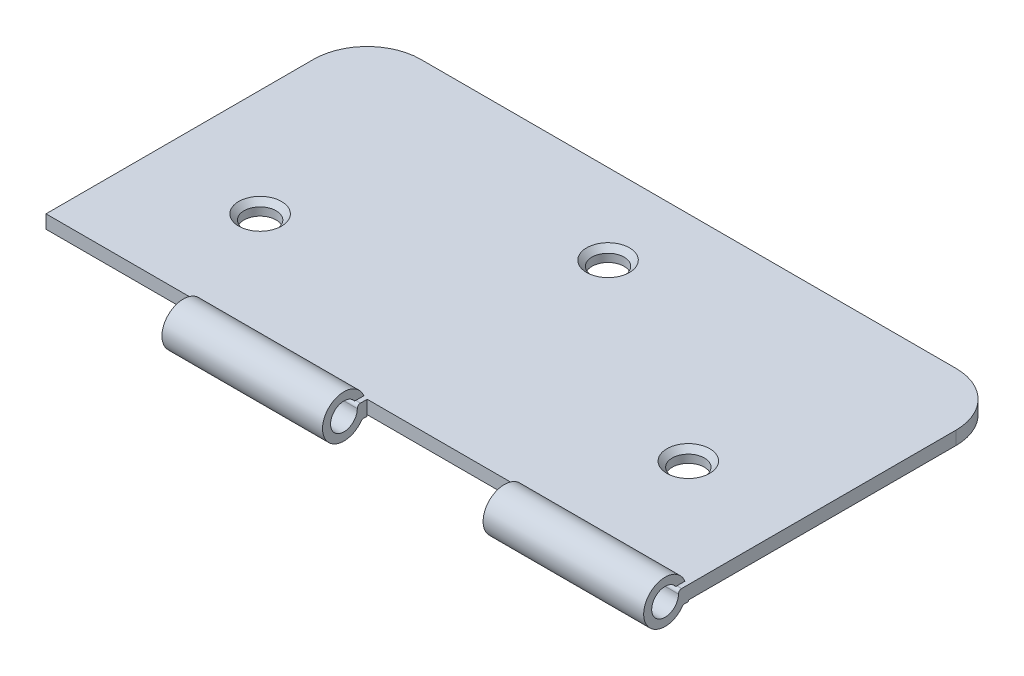
ISO-10303-21;
HEADER;
FILE_DESCRIPTION(('STEP AP214'),'2;1');
FILE_NAME('part.step','',(''),(''),'','','');
FILE_SCHEMA(('AUTOMOTIVE_DESIGN { 1 0 10303 214 1 1 1 1 }'));
ENDSEC;
DATA;
#1=APPLICATION_CONTEXT('core data for automotive mechanical design processes');
#2=APPLICATION_PROTOCOL_DEFINITION('international standard','automotive_design',2000,#1);
#3=PRODUCT_CONTEXT('',#1,'mechanical');
#4=PRODUCT('Part','Part','',(#3));
#5=PRODUCT_RELATED_PRODUCT_CATEGORY('part','',(#4));
#6=PRODUCT_DEFINITION_FORMATION('','',#4);
#7=PRODUCT_DEFINITION_CONTEXT('part definition',#1,'design');
#8=PRODUCT_DEFINITION('design','',#6,#7);
#9=PRODUCT_DEFINITION_SHAPE('','',#8);
#10=(LENGTH_UNIT() NAMED_UNIT(*) SI_UNIT(.MILLI.,.METRE.));
#11=(NAMED_UNIT(*) PLANE_ANGLE_UNIT() SI_UNIT($,.RADIAN.));
#12=(NAMED_UNIT(*) SI_UNIT($,.STERADIAN.) SOLID_ANGLE_UNIT());
#13=UNCERTAINTY_MEASURE_WITH_UNIT(LENGTH_MEASURE(1.E-05),#10,'distance_accuracy_value','');
#14=(GEOMETRIC_REPRESENTATION_CONTEXT(3) GLOBAL_UNCERTAINTY_ASSIGNED_CONTEXT((#13)) GLOBAL_UNIT_ASSIGNED_CONTEXT((#10,
#11,#12)) REPRESENTATION_CONTEXT('',''));
#15=CARTESIAN_POINT('',(0.,0.,0.));
#16=DIRECTION('',(0.,0.,1.));
#17=DIRECTION('',(1.,0.,0.));
#18=AXIS2_PLACEMENT_3D('',#15,#16,#17);
#19=CARTESIAN_POINT('',(-30.,2.5,30.));
#20=DIRECTION('',(0.,1.,0.));
#21=DIRECTION('',(0.,0.,1.));
#22=AXIS2_PLACEMENT_3D('',#19,#20,#21);
#23=PLANE('',#22);
#24=DIRECTION('',(0.,0.,1.));
#25=VECTOR('',#24,1.);
#26=CARTESIAN_POINT('',(0.,2.5,30.));
#27=LINE('',#26,#25);
#28=CARTESIAN_POINT('',(0.,2.5,30.));
#29=VERTEX_POINT('',#28);
#30=CARTESIAN_POINT('',(0.,2.5,31.25));
#31=VERTEX_POINT('',#30);
#32=EDGE_CURVE('E142',#29,#31,#27,.T.);
#33=ORIENTED_EDGE('',*,*,#32,.F.);
#34=DIRECTION('',(1.,0.,0.));
#35=VECTOR('',#34,1.);
#36=CARTESIAN_POINT('',(60.,2.5,30.));
#37=LINE('',#36,#35);
#38=CARTESIAN_POINT('',(30.,2.5,30.));
#39=VERTEX_POINT('',#38);
#40=EDGE_CURVE('E86',#29,#39,#37,.T.);
#41=ORIENTED_EDGE('',*,*,#40,.T.);
#42=DIRECTION('',(0.,0.,1.));
#43=VECTOR('',#42,1.);
#44=CARTESIAN_POINT('',(30.,2.5,30.));
#45=LINE('',#44,#43);
#46=CARTESIAN_POINT('',(30.,2.5,31.25));
#47=VERTEX_POINT('',#46);
#48=EDGE_CURVE('E311',#39,#47,#45,.T.);
#49=ORIENTED_EDGE('',*,*,#48,.T.);
#50=DIRECTION('',(1.,0.,0.));
#51=VECTOR('',#50,1.);
#52=CARTESIAN_POINT('',(30.,2.5,31.25));
#53=LINE('',#52,#51);
#54=CARTESIAN_POINT('',(60.,2.5,31.25));
#55=VERTEX_POINT('',#54);
#56=EDGE_CURVE('E240',#47,#55,#53,.T.);
#57=ORIENTED_EDGE('',*,*,#56,.T.);
#58=DIRECTION('',(0.,0.,1.));
#59=VECTOR('',#58,1.);
#60=CARTESIAN_POINT('',(60.,2.5,30.));
#61=LINE('',#60,#59);
#62=CARTESIAN_POINT('',(60.,2.5,-20.));
#63=VERTEX_POINT('',#62);
#64=EDGE_CURVE('E310',#63,#55,#61,.T.);
#65=ORIENTED_EDGE('',*,*,#64,.F.);
#66=CARTESIAN_POINT('',(50.,2.5,-20.));
#67=DIRECTION('',(0.,-1.,0.));
#68=DIRECTION('',(0.,0.,-1.));
#69=AXIS2_PLACEMENT_3D('',#66,#67,#68);
#70=CIRCLE('',#69,10.);
#71=CARTESIAN_POINT('',(50.,2.5,-30.));
#72=VERTEX_POINT('',#71);
#73=EDGE_CURVE('E441',#63,#72,#70,.F.);
#74=ORIENTED_EDGE('',*,*,#73,.T.);
#75=DIRECTION('',(-1.,0.,0.));
#76=VECTOR('',#75,1.);
#77=CARTESIAN_POINT('',(60.,2.5,-30.));
#78=LINE('',#77,#76);
#79=CARTESIAN_POINT('',(-50.,2.5,-30.));
#80=VERTEX_POINT('',#79);
#81=EDGE_CURVE('E267',#72,#80,#78,.T.);
#82=ORIENTED_EDGE('',*,*,#81,.T.);
#83=CARTESIAN_POINT('',(-50.,2.5,-20.));
#84=DIRECTION('',(0.,-1.,0.));
#85=DIRECTION('',(0.,0.,-1.));
#86=AXIS2_PLACEMENT_3D('',#83,#84,#85);
#87=CIRCLE('',#86,10.);
#88=CARTESIAN_POINT('',(-60.,2.5,-20.));
#89=VERTEX_POINT('',#88);
#90=EDGE_CURVE('E442',#80,#89,#87,.F.);
#91=ORIENTED_EDGE('',*,*,#90,.T.);
#92=DIRECTION('',(0.,0.,1.));
#93=VECTOR('',#92,1.);
#94=CARTESIAN_POINT('',(-60.,2.5,-30.));
#95=LINE('',#94,#93);
#96=CARTESIAN_POINT('',(-60.,2.5,30.));
#97=VERTEX_POINT('',#96);
#98=EDGE_CURVE('E266',#89,#97,#95,.T.);
#99=ORIENTED_EDGE('',*,*,#98,.T.);
#100=CARTESIAN_POINT('',(-30.,2.5,30.));
#101=VERTEX_POINT('',#100);
#102=EDGE_CURVE('E261',#97,#101,#37,.T.);
#103=ORIENTED_EDGE('',*,*,#102,.T.);
#104=DIRECTION('',(0.,0.,1.));
#105=VECTOR('',#104,1.);
#106=CARTESIAN_POINT('',(-30.,2.5,30.));
#107=LINE('',#106,#105);
#108=CARTESIAN_POINT('',(-30.,2.5,31.25));
#109=VERTEX_POINT('',#108);
#110=EDGE_CURVE('E163',#101,#109,#107,.T.);
#111=ORIENTED_EDGE('',*,*,#110,.T.);
#112=DIRECTION('',(1.,0.,0.));
#113=VECTOR('',#112,1.);
#114=CARTESIAN_POINT('',(-30.,2.5,31.25));
#115=LINE('',#114,#113);
#116=EDGE_CURVE('E38',#109,#31,#115,.T.);
#117=ORIENTED_EDGE('',*,*,#116,.T.);
#118=EDGE_LOOP('',(#33,#41,#49,#57,#65,#74,#82,#91,#99,#103,#111,#117));
#119=FACE_BOUND('',#118,.T.);
#120=CARTESIAN_POINT('',(-40.,2.5,10.));
#121=DIRECTION('',(0.,-1.,0.));
#122=DIRECTION('',(0.,0.,-1.));
#123=AXIS2_PLACEMENT_3D('',#120,#121,#122);
#124=CIRCLE('',#123,3.99999999999998);
#125=CARTESIAN_POINT('',(-40.,2.5,6.00000000000003));
#126=VERTEX_POINT('',#125);
#127=EDGE_CURVE('E301',#126,#126,#124,.T.);
#128=ORIENTED_EDGE('',*,*,#127,.T.);
#129=EDGE_LOOP('',(#128));
#130=FACE_BOUND('',#129,.T.);
#131=CARTESIAN_POINT('',(40.,2.5,10.));
#132=DIRECTION('',(0.,-1.,0.));
#133=DIRECTION('',(0.,0.,-1.));
#134=AXIS2_PLACEMENT_3D('',#131,#132,#133);
#135=CIRCLE('',#134,3.99999999999998);
#136=CARTESIAN_POINT('',(40.,2.5,6.00000000000003));
#137=VERTEX_POINT('',#136);
#138=EDGE_CURVE('E298',#137,#137,#135,.T.);
#139=ORIENTED_EDGE('',*,*,#138,.T.);
#140=EDGE_LOOP('',(#139));
#141=FACE_BOUND('',#140,.T.);
#142=CARTESIAN_POINT('',(0.,2.5,-15.));
#143=DIRECTION('',(0.,-1.,0.));
#144=DIRECTION('',(0.,0.,-1.));
#145=AXIS2_PLACEMENT_3D('',#142,#143,#144);
#146=CIRCLE('',#145,3.99999999999998);
#147=CARTESIAN_POINT('',(0.,2.5,-19.));
#148=VERTEX_POINT('',#147);
#149=EDGE_CURVE('E295',#148,#148,#146,.T.);
#150=ORIENTED_EDGE('',*,*,#149,.T.);
#151=EDGE_LOOP('',(#150));
#152=FACE_BOUND('',#151,.T.);
#153=ADVANCED_FACE('F35',(#119,#130,#141,#152),#23,.T.);
#154=CARTESIAN_POINT('',(-30.,2.5,30.));
#155=DIRECTION('',(0.,0.,-1.));
#156=DIRECTION('',(-1.,0.,0.));
#157=AXIS2_PLACEMENT_3D('',#154,#155,#156);
#158=PLANE('',#157);
#159=DIRECTION('',(1.,0.,0.));
#160=VECTOR('',#159,1.);
#161=CARTESIAN_POINT('',(60.,0.,30.));
#162=LINE('',#161,#160);
#163=CARTESIAN_POINT('',(-30.,0.,30.));
#164=VERTEX_POINT('',#163);
#165=CARTESIAN_POINT('',(0.,0.,30.));
#166=VERTEX_POINT('',#165);
#167=EDGE_CURVE('E192',#164,#166,#162,.T.);
#168=ORIENTED_EDGE('',*,*,#167,.T.);
#169=DIRECTION('',(0.,1.,0.));
#170=VECTOR('',#169,1.);
#171=CARTESIAN_POINT('',(0.,2.5,30.));
#172=LINE('',#171,#170);
#173=CARTESIAN_POINT('',(0.,-0.25,30.));
#174=VERTEX_POINT('',#173);
#175=EDGE_CURVE('E161',#174,#166,#172,.T.);
#176=ORIENTED_EDGE('',*,*,#175,.F.);
#177=DIRECTION('',(1.,0.,0.));
#178=VECTOR('',#177,1.);
#179=CARTESIAN_POINT('',(-30.,-0.25,30.));
#180=LINE('',#179,#178);
#181=CARTESIAN_POINT('',(-30.,-0.25,30.));
#182=VERTEX_POINT('',#181);
#183=EDGE_CURVE('E11',#182,#174,#180,.T.);
#184=ORIENTED_EDGE('',*,*,#183,.F.);
#185=DIRECTION('',(0.,1.,0.));
#186=VECTOR('',#185,1.);
#187=CARTESIAN_POINT('',(-30.,2.5,30.));
#188=LINE('',#187,#186);
#189=EDGE_CURVE('E140',#182,#164,#188,.T.);
#190=ORIENTED_EDGE('',*,*,#189,.T.);
#191=EDGE_LOOP('',(#168,#176,#184,#190));
#192=FACE_BOUND('',#191,.T.);
#193=ADVANCED_FACE('F201',(#192),#158,.T.);
#194=CARTESIAN_POINT('',(-30.,-0.25,30.));
#195=DIRECTION('',(0.,-1.,0.));
#196=DIRECTION('',(0.,0.,-1.));
#197=AXIS2_PLACEMENT_3D('',#194,#195,#196);
#198=PLANE('',#197);
#199=DIRECTION('',(0.,0.,-1.));
#200=VECTOR('',#199,1.);
#201=CARTESIAN_POINT('',(0.,-0.25,30.));
#202=LINE('',#201,#200);
#203=CARTESIAN_POINT('',(0.,-0.25,30.7));
#204=VERTEX_POINT('',#203);
#205=EDGE_CURVE('E158',#204,#174,#202,.T.);
#206=ORIENTED_EDGE('',*,*,#205,.F.);
#207=DIRECTION('',(1.,0.,0.));
#208=VECTOR('',#207,1.);
#209=CARTESIAN_POINT('',(-30.,-0.25,30.7));
#210=LINE('',#209,#208);
#211=CARTESIAN_POINT('',(-30.,-0.25,30.7));
#212=VERTEX_POINT('',#211);
#213=EDGE_CURVE('E44',#212,#204,#210,.T.);
#214=ORIENTED_EDGE('',*,*,#213,.F.);
#215=DIRECTION('',(0.,0.,-1.));
#216=VECTOR('',#215,1.);
#217=CARTESIAN_POINT('',(-30.,-0.25,30.));
#218=LINE('',#217,#216);
#219=EDGE_CURVE('E130',#212,#182,#218,.T.);
#220=ORIENTED_EDGE('',*,*,#219,.T.);
#221=ORIENTED_EDGE('',*,*,#183,.T.);
#222=EDGE_LOOP('',(#206,#214,#220,#221));
#223=FACE_BOUND('',#222,.T.);
#224=ADVANCED_FACE('F253',(#223),#198,.T.);
#225=CARTESIAN_POINT('',(-30.,-0.75,30.7));
#226=DIRECTION('',(1.,0.,0.));
#227=DIRECTION('',(0.,0.,-1.));
#228=AXIS2_PLACEMENT_3D('',#225,#226,#227);
#229=CYLINDRICAL_SURFACE('',#228,0.5);
#230=CARTESIAN_POINT('',(0.,-0.75,30.7));
#231=DIRECTION('',(-1.,0.,0.));
#232=DIRECTION('',(0.,0.,-1.));
#233=AXIS2_PLACEMENT_3D('',#230,#231,#232);
#234=CIRCLE('',#233,0.5);
#235=CARTESIAN_POINT('',(0.,-0.456424291951629,31.1047385620915));
#236=VERTEX_POINT('',#235);
#237=EDGE_CURVE('E114',#236,#204,#234,.T.);
#238=ORIENTED_EDGE('',*,*,#237,.F.);
#239=DIRECTION('',(1.,0.,0.));
#240=VECTOR('',#239,1.);
#241=CARTESIAN_POINT('',(-30.,-0.456424291951629,31.1047385620915));
#242=LINE('',#241,#240);
#243=CARTESIAN_POINT('',(-30.,-0.456424291951629,31.1047385620915));
#244=VERTEX_POINT('',#243);
#245=EDGE_CURVE('E109',#244,#236,#242,.T.);
#246=ORIENTED_EDGE('',*,*,#245,.F.);
#247=CARTESIAN_POINT('',(-30.,-0.75,30.7));
#248=DIRECTION('',(-1.,0.,0.));
#249=DIRECTION('',(0.,0.,-1.));
#250=AXIS2_PLACEMENT_3D('',#247,#248,#249);
#251=CIRCLE('',#250,0.5);
#252=EDGE_CURVE('E112',#244,#212,#251,.T.);
#253=ORIENTED_EDGE('',*,*,#252,.T.);
#254=ORIENTED_EDGE('',*,*,#213,.T.);
#255=EDGE_LOOP('',(#238,#246,#253,#254));
#256=FACE_BOUND('',#255,.T.);
#257=ADVANCED_FACE('F111',(#256),#229,.F.);
#258=CARTESIAN_POINT('',(-30.,1.89218137243533,34.3426470588235));
#259=DIRECTION('',(1.,0.,0.));
#260=DIRECTION('',(0.,0.,-1.));
#261=AXIS2_PLACEMENT_3D('',#258,#259,#260);
#262=CYLINDRICAL_SURFACE('',#261,4.);
#263=CARTESIAN_POINT('',(0.,1.89218137243533,34.3426470588235));
#264=DIRECTION('',(1.,0.,0.));
#265=DIRECTION('',(0.,0.,1.));
#266=AXIS2_PLACEMENT_3D('',#263,#264,#265);
#267=CIRCLE('',#266,4.);
#268=CARTESIAN_POINT('',(0.,3.36835898573962,30.625));
#269=VERTEX_POINT('',#268);
#270=EDGE_CURVE('E155',#269,#236,#267,.T.);
#271=ORIENTED_EDGE('',*,*,#270,.F.);
#272=DIRECTION('',(1.,0.,0.));
#273=VECTOR('',#272,1.);
#274=CARTESIAN_POINT('',(-30.,3.36835898573962,30.625));
#275=LINE('',#274,#273);
#276=CARTESIAN_POINT('',(-30.,3.36835898573962,30.625));
#277=VERTEX_POINT('',#276);
#278=EDGE_CURVE('E119',#277,#269,#275,.T.);
#279=ORIENTED_EDGE('',*,*,#278,.F.);
#280=CARTESIAN_POINT('',(-30.,1.89218137243533,34.3426470588235));
#281=DIRECTION('',(1.,0.,0.));
#282=DIRECTION('',(0.,0.,1.));
#283=AXIS2_PLACEMENT_3D('',#280,#281,#282);
#284=CIRCLE('',#283,4.);
#285=EDGE_CURVE('E127',#277,#244,#284,.T.);
#286=ORIENTED_EDGE('',*,*,#285,.T.);
#287=ORIENTED_EDGE('',*,*,#245,.T.);
#288=EDGE_LOOP('',(#271,#279,#286,#287));
#289=FACE_BOUND('',#288,.T.);
#290=ADVANCED_FACE('F132',(#289),#262,.T.);
#291=CARTESIAN_POINT('',(-30.,3.36835898573963,30.625));
#292=DIRECTION('',(0.,-1.,0.));
#293=DIRECTION('',(0.,0.,-1.));
#294=AXIS2_PLACEMENT_3D('',#291,#292,#293);
#295=PLANE('',#294);
#296=DIRECTION('',(0.,0.,-1.));
#297=VECTOR('',#296,1.);
#298=CARTESIAN_POINT('',(0.,3.36835898573963,30.625));
#299=LINE('',#298,#297);
#300=CARTESIAN_POINT('',(0.,3.36835898573963,32.325));
#301=VERTEX_POINT('',#300);
#302=EDGE_CURVE('E152',#301,#269,#299,.T.);
#303=ORIENTED_EDGE('',*,*,#302,.F.);
#304=DIRECTION('',(1.,0.,0.));
#305=VECTOR('',#304,1.);
#306=CARTESIAN_POINT('',(-30.,3.36835898573963,32.325));
#307=LINE('',#306,#305);
#308=CARTESIAN_POINT('',(-30.,3.36835898573963,32.325));
#309=VERTEX_POINT('',#308);
#310=EDGE_CURVE('E167',#309,#301,#307,.T.);
#311=ORIENTED_EDGE('',*,*,#310,.F.);
#312=DIRECTION('',(0.,0.,-1.));
#313=VECTOR('',#312,1.);
#314=CARTESIAN_POINT('',(-30.,3.36835898573963,30.625));
#315=LINE('',#314,#313);
#316=EDGE_CURVE('E133',#309,#277,#315,.T.);
#317=ORIENTED_EDGE('',*,*,#316,.T.);
#318=ORIENTED_EDGE('',*,*,#278,.T.);
#319=EDGE_LOOP('',(#303,#311,#317,#318));
#320=FACE_BOUND('',#319,.T.);
#321=ADVANCED_FACE('F252',(#320),#295,.T.);
#322=CARTESIAN_POINT('',(-30.,1.89218137243533,34.3426470588235));
#323=DIRECTION('',(1.,0.,0.));
#324=DIRECTION('',(0.,0.,-1.));
#325=AXIS2_PLACEMENT_3D('',#322,#323,#324);
#326=CYLINDRICAL_SURFACE('',#325,2.5);
#327=CARTESIAN_POINT('',(0.,1.89218137243533,34.3426470588235));
#328=DIRECTION('',(-1.,0.,0.));
#329=DIRECTION('',(0.,0.,1.));
#330=AXIS2_PLACEMENT_3D('',#327,#328,#329);
#331=CIRCLE('',#330,2.5);
#332=CARTESIAN_POINT('',(0.,1.90441551634984,31.8426769938582));
#333=VERTEX_POINT('',#332);
#334=EDGE_CURVE('E149',#333,#301,#331,.T.);
#335=ORIENTED_EDGE('',*,*,#334,.F.);
#336=DIRECTION('',(1.,0.,0.));
#337=VECTOR('',#336,1.);
#338=CARTESIAN_POINT('',(-30.,1.90441551634984,31.8426769938582));
#339=LINE('',#338,#337);
#340=CARTESIAN_POINT('',(-30.,1.90441551634984,31.8426769938582));
#341=VERTEX_POINT('',#340);
#342=EDGE_CURVE('E168',#341,#333,#339,.T.);
#343=ORIENTED_EDGE('',*,*,#342,.F.);
#344=CARTESIAN_POINT('',(-30.,1.89218137243533,34.3426470588235));
#345=DIRECTION('',(-1.,0.,0.));
#346=DIRECTION('',(0.,0.,1.));
#347=AXIS2_PLACEMENT_3D('',#344,#345,#346);
#348=CIRCLE('',#347,2.5);
#349=EDGE_CURVE('E135',#341,#309,#348,.T.);
#350=ORIENTED_EDGE('',*,*,#349,.T.);
#351=ORIENTED_EDGE('',*,*,#310,.T.);
#352=EDGE_LOOP('',(#335,#343,#350,#351));
#353=FACE_BOUND('',#352,.T.);
#354=ADVANCED_FACE('F249',(#353),#326,.F.);
#355=CARTESIAN_POINT('',(-30.,1.90731590933426,31.25));
#356=DIRECTION('',(1.,0.,0.));
#357=DIRECTION('',(0.,0.,-1.));
#358=AXIS2_PLACEMENT_3D('',#355,#356,#357);
#359=CYLINDRICAL_SURFACE('',#358,0.592684090665747);
#360=CARTESIAN_POINT('',(0.,1.90731590933426,31.25));
#361=DIRECTION('',(1.,0.,0.));
#362=DIRECTION('',(0.,0.,-1.));
#363=AXIS2_PLACEMENT_3D('',#360,#361,#362);
#364=CIRCLE('',#363,0.592684090665747);
#365=EDGE_CURVE('E145',#31,#333,#364,.T.);
#366=ORIENTED_EDGE('',*,*,#365,.F.);
#367=ORIENTED_EDGE('',*,*,#116,.F.);
#368=CARTESIAN_POINT('',(-30.,1.90731590933426,31.25));
#369=DIRECTION('',(1.,0.,0.));
#370=DIRECTION('',(0.,0.,-1.));
#371=AXIS2_PLACEMENT_3D('',#368,#369,#370);
#372=CIRCLE('',#371,0.592684090665747);
#373=EDGE_CURVE('E245',#109,#341,#372,.T.);
#374=ORIENTED_EDGE('',*,*,#373,.T.);
#375=ORIENTED_EDGE('',*,*,#342,.T.);
#376=EDGE_LOOP('',(#366,#367,#374,#375));
#377=FACE_BOUND('',#376,.T.);
#378=ADVANCED_FACE('F175',(#377),#359,.T.);
#379=CARTESIAN_POINT('',(-30.,1.90731590933426,31.25));
#380=DIRECTION('',(1.,0.,0.));
#381=DIRECTION('',(0.,0.,-1.));
#382=AXIS2_PLACEMENT_3D('',#379,#380,#381);
#383=PLANE('',#382);
#384=ORIENTED_EDGE('',*,*,#110,.F.);
#385=DIRECTION('',(0.,1.,0.));
#386=VECTOR('',#385,1.);
#387=CARTESIAN_POINT('',(-30.,1.90731590933426,30.));
#388=LINE('',#387,#386);
#389=EDGE_CURVE('E146',#164,#101,#388,.T.);
#390=ORIENTED_EDGE('',*,*,#389,.F.);
#391=ORIENTED_EDGE('',*,*,#189,.F.);
#392=ORIENTED_EDGE('',*,*,#219,.F.);
#393=ORIENTED_EDGE('',*,*,#252,.F.);
#394=ORIENTED_EDGE('',*,*,#285,.F.);
#395=ORIENTED_EDGE('',*,*,#316,.F.);
#396=ORIENTED_EDGE('',*,*,#349,.F.);
#397=ORIENTED_EDGE('',*,*,#373,.F.);
#398=EDGE_LOOP('',(#384,#390,#391,#392,#393,#394,#395,#396,#397));
#399=FACE_BOUND('',#398,.T.);
#400=ADVANCED_FACE('F125',(#399),#383,.F.);
#401=CARTESIAN_POINT('',(0.,1.90731590933426,31.25));
#402=DIRECTION('',(1.,0.,0.));
#403=DIRECTION('',(0.,0.,-1.));
#404=AXIS2_PLACEMENT_3D('',#401,#402,#403);
#405=PLANE('',#404);
#406=ORIENTED_EDGE('',*,*,#32,.T.);
#407=ORIENTED_EDGE('',*,*,#365,.T.);
#408=ORIENTED_EDGE('',*,*,#334,.T.);
#409=ORIENTED_EDGE('',*,*,#302,.T.);
#410=ORIENTED_EDGE('',*,*,#270,.T.);
#411=ORIENTED_EDGE('',*,*,#237,.T.);
#412=ORIENTED_EDGE('',*,*,#205,.T.);
#413=ORIENTED_EDGE('',*,*,#175,.T.);
#414=EDGE_CURVE('E160',#166,#29,#172,.T.);
#415=ORIENTED_EDGE('',*,*,#414,.T.);
#416=EDGE_LOOP('',(#406,#407,#408,#409,#410,#411,#412,#413,#415));
#417=FACE_BOUND('',#416,.T.);
#418=ADVANCED_FACE('F177',(#417),#405,.T.);
#419=CARTESIAN_POINT('',(60.,2.5,30.));
#420=DIRECTION('',(0.,0.,-1.));
#421=DIRECTION('',(-1.,0.,0.));
#422=AXIS2_PLACEMENT_3D('',#419,#420,#421);
#423=PLANE('',#422);
#424=CARTESIAN_POINT('',(-60.,0.,30.));
#425=VERTEX_POINT('',#424);
#426=EDGE_CURVE('E200',#425,#164,#162,.T.);
#427=ORIENTED_EDGE('',*,*,#426,.T.);
#428=ORIENTED_EDGE('',*,*,#389,.T.);
#429=ORIENTED_EDGE('',*,*,#102,.F.);
#430=DIRECTION('',(0.,-1.,0.));
#431=VECTOR('',#430,1.);
#432=CARTESIAN_POINT('',(-60.,2.5,30.));
#433=LINE('',#432,#431);
#434=EDGE_CURVE('E270',#97,#425,#433,.T.);
#435=ORIENTED_EDGE('',*,*,#434,.T.);
#436=EDGE_LOOP('',(#427,#428,#429,#435));
#437=FACE_BOUND('',#436,.T.);
#438=ADVANCED_FACE('F258',(#437),#423,.F.);
#439=CARTESIAN_POINT('',(30.,2.5,30.));
#440=DIRECTION('',(0.,0.,-1.));
#441=DIRECTION('',(-1.,0.,0.));
#442=AXIS2_PLACEMENT_3D('',#439,#440,#441);
#443=PLANE('',#442);
#444=DIRECTION('',(0.,1.,0.));
#445=VECTOR('',#444,1.);
#446=CARTESIAN_POINT('',(30.,2.5,30.));
#447=LINE('',#446,#445);
#448=CARTESIAN_POINT('',(30.,-0.25,30.));
#449=VERTEX_POINT('',#448);
#450=CARTESIAN_POINT('',(30.,0.,30.));
#451=VERTEX_POINT('',#450);
#452=EDGE_CURVE('E242',#449,#451,#447,.T.);
#453=ORIENTED_EDGE('',*,*,#452,.T.);
#454=CARTESIAN_POINT('',(60.,0.,30.));
#455=VERTEX_POINT('',#454);
#456=EDGE_CURVE('E196',#451,#455,#162,.T.);
#457=ORIENTED_EDGE('',*,*,#456,.T.);
#458=DIRECTION('',(0.,1.,0.));
#459=VECTOR('',#458,1.);
#460=CARTESIAN_POINT('',(60.,2.5,30.));
#461=LINE('',#460,#459);
#462=CARTESIAN_POINT('',(60.,-0.25,30.));
#463=VERTEX_POINT('',#462);
#464=EDGE_CURVE('E226',#463,#455,#461,.T.);
#465=ORIENTED_EDGE('',*,*,#464,.F.);
#466=DIRECTION('',(1.,0.,0.));
#467=VECTOR('',#466,1.);
#468=CARTESIAN_POINT('',(30.,-0.25,30.));
#469=LINE('',#468,#467);
#470=EDGE_CURVE('E205',#449,#463,#469,.T.);
#471=ORIENTED_EDGE('',*,*,#470,.F.);
#472=EDGE_LOOP('',(#453,#457,#465,#471));
#473=FACE_BOUND('',#472,.T.);
#474=ADVANCED_FACE('F358',(#473),#443,.T.);
#475=CARTESIAN_POINT('',(30.,-0.25,30.));
#476=DIRECTION('',(0.,-1.,0.));
#477=DIRECTION('',(0.,0.,-1.));
#478=AXIS2_PLACEMENT_3D('',#475,#476,#477);
#479=PLANE('',#478);
#480=DIRECTION('',(0.,0.,-1.));
#481=VECTOR('',#480,1.);
#482=CARTESIAN_POINT('',(60.,-0.25,30.));
#483=LINE('',#482,#481);
#484=CARTESIAN_POINT('',(60.,-0.25,30.7));
#485=VERTEX_POINT('',#484);
#486=EDGE_CURVE('E349',#485,#463,#483,.T.);
#487=ORIENTED_EDGE('',*,*,#486,.F.);
#488=DIRECTION('',(1.,0.,0.));
#489=VECTOR('',#488,1.);
#490=CARTESIAN_POINT('',(30.,-0.25,30.7));
#491=LINE('',#490,#489);
#492=CARTESIAN_POINT('',(30.,-0.25,30.7));
#493=VERTEX_POINT('',#492);
#494=EDGE_CURVE('E214',#493,#485,#491,.T.);
#495=ORIENTED_EDGE('',*,*,#494,.F.);
#496=DIRECTION('',(0.,0.,-1.));
#497=VECTOR('',#496,1.);
#498=CARTESIAN_POINT('',(30.,-0.25,30.));
#499=LINE('',#498,#497);
#500=EDGE_CURVE('E329',#493,#449,#499,.T.);
#501=ORIENTED_EDGE('',*,*,#500,.T.);
#502=ORIENTED_EDGE('',*,*,#470,.T.);
#503=EDGE_LOOP('',(#487,#495,#501,#502));
#504=FACE_BOUND('',#503,.T.);
#505=ADVANCED_FACE('F507',(#504),#479,.T.);
#506=CARTESIAN_POINT('',(30.,-0.75,30.7));
#507=DIRECTION('',(1.,0.,0.));
#508=DIRECTION('',(0.,0.,-1.));
#509=AXIS2_PLACEMENT_3D('',#506,#507,#508);
#510=CYLINDRICAL_SURFACE('',#509,0.5);
#511=CARTESIAN_POINT('',(60.,-0.75,30.7));
#512=DIRECTION('',(-1.,0.,0.));
#513=DIRECTION('',(0.,0.,-1.));
#514=AXIS2_PLACEMENT_3D('',#511,#512,#513);
#515=CIRCLE('',#514,0.5);
#516=CARTESIAN_POINT('',(60.,-0.456424291951629,31.1047385620915));
#517=VERTEX_POINT('',#516);
#518=EDGE_CURVE('E347',#517,#485,#515,.T.);
#519=ORIENTED_EDGE('',*,*,#518,.F.);
#520=DIRECTION('',(1.,0.,0.));
#521=VECTOR('',#520,1.);
#522=CARTESIAN_POINT('',(30.,-0.456424291951629,31.1047385620915));
#523=LINE('',#522,#521);
#524=CARTESIAN_POINT('',(30.,-0.456424291951629,31.1047385620915));
#525=VERTEX_POINT('',#524);
#526=EDGE_CURVE('E223',#525,#517,#523,.T.);
#527=ORIENTED_EDGE('',*,*,#526,.F.);
#528=CARTESIAN_POINT('',(30.,-0.75,30.7));
#529=DIRECTION('',(-1.,0.,0.));
#530=DIRECTION('',(0.,0.,-1.));
#531=AXIS2_PLACEMENT_3D('',#528,#529,#530);
#532=CIRCLE('',#531,0.5);
#533=EDGE_CURVE('E326',#525,#493,#532,.T.);
#534=ORIENTED_EDGE('',*,*,#533,.T.);
#535=ORIENTED_EDGE('',*,*,#494,.T.);
#536=EDGE_LOOP('',(#519,#527,#534,#535));
#537=FACE_BOUND('',#536,.T.);
#538=ADVANCED_FACE('F503',(#537),#510,.F.);
#539=CARTESIAN_POINT('',(30.,1.89218137243533,34.3426470588235));
#540=DIRECTION('',(1.,0.,0.));
#541=DIRECTION('',(0.,0.,-1.));
#542=AXIS2_PLACEMENT_3D('',#539,#540,#541);
#543=CYLINDRICAL_SURFACE('',#542,4.);
#544=CARTESIAN_POINT('',(60.,1.89218137243533,34.3426470588235));
#545=DIRECTION('',(1.,0.,0.));
#546=DIRECTION('',(0.,0.,1.));
#547=AXIS2_PLACEMENT_3D('',#544,#545,#546);
#548=CIRCLE('',#547,4.);
#549=CARTESIAN_POINT('',(60.,3.36835898573962,30.625));
#550=VERTEX_POINT('',#549);
#551=EDGE_CURVE('E344',#550,#517,#548,.T.);
#552=ORIENTED_EDGE('',*,*,#551,.F.);
#553=DIRECTION('',(1.,0.,0.));
#554=VECTOR('',#553,1.);
#555=CARTESIAN_POINT('',(30.,3.36835898573962,30.625));
#556=LINE('',#555,#554);
#557=CARTESIAN_POINT('',(30.,3.36835898573962,30.625));
#558=VERTEX_POINT('',#557);
#559=EDGE_CURVE('E231',#558,#550,#556,.T.);
#560=ORIENTED_EDGE('',*,*,#559,.F.);
#561=CARTESIAN_POINT('',(30.,1.89218137243533,34.3426470588235));
#562=DIRECTION('',(1.,0.,0.));
#563=DIRECTION('',(0.,0.,1.));
#564=AXIS2_PLACEMENT_3D('',#561,#562,#563);
#565=CIRCLE('',#564,4.);
#566=EDGE_CURVE('E323',#558,#525,#565,.T.);
#567=ORIENTED_EDGE('',*,*,#566,.T.);
#568=ORIENTED_EDGE('',*,*,#526,.T.);
#569=EDGE_LOOP('',(#552,#560,#567,#568));
#570=FACE_BOUND('',#569,.T.);
#571=ADVANCED_FACE('F499',(#570),#543,.T.);
#572=CARTESIAN_POINT('',(30.,3.36835898573963,30.625));
#573=DIRECTION('',(0.,-1.,0.));
#574=DIRECTION('',(0.,0.,-1.));
#575=AXIS2_PLACEMENT_3D('',#572,#573,#574);
#576=PLANE('',#575);
#577=DIRECTION('',(0.,0.,-1.));
#578=VECTOR('',#577,1.);
#579=CARTESIAN_POINT('',(60.,3.36835898573963,30.625));
#580=LINE('',#579,#578);
#581=CARTESIAN_POINT('',(60.,3.36835898573963,32.325));
#582=VERTEX_POINT('',#581);
#583=EDGE_CURVE('E341',#582,#550,#580,.T.);
#584=ORIENTED_EDGE('',*,*,#583,.F.);
#585=DIRECTION('',(1.,0.,0.));
#586=VECTOR('',#585,1.);
#587=CARTESIAN_POINT('',(30.,3.36835898573963,32.325));
#588=LINE('',#587,#586);
#589=CARTESIAN_POINT('',(30.,3.36835898573963,32.325));
#590=VERTEX_POINT('',#589);
#591=EDGE_CURVE('E234',#590,#582,#588,.T.);
#592=ORIENTED_EDGE('',*,*,#591,.F.);
#593=DIRECTION('',(0.,0.,-1.));
#594=VECTOR('',#593,1.);
#595=CARTESIAN_POINT('',(30.,3.36835898573963,30.625));
#596=LINE('',#595,#594);
#597=EDGE_CURVE('E320',#590,#558,#596,.T.);
#598=ORIENTED_EDGE('',*,*,#597,.T.);
#599=ORIENTED_EDGE('',*,*,#559,.T.);
#600=EDGE_LOOP('',(#584,#592,#598,#599));
#601=FACE_BOUND('',#600,.T.);
#602=ADVANCED_FACE('F495',(#601),#576,.T.);
#603=CARTESIAN_POINT('',(30.,1.89218137243533,34.3426470588235));
#604=DIRECTION('',(1.,0.,0.));
#605=DIRECTION('',(0.,0.,-1.));
#606=AXIS2_PLACEMENT_3D('',#603,#604,#605);
#607=CYLINDRICAL_SURFACE('',#606,2.5);
#608=CARTESIAN_POINT('',(60.,1.89218137243533,34.3426470588235));
#609=DIRECTION('',(-1.,0.,0.));
#610=DIRECTION('',(0.,0.,1.));
#611=AXIS2_PLACEMENT_3D('',#608,#609,#610);
#612=CIRCLE('',#611,2.5);
#613=CARTESIAN_POINT('',(60.,1.90441551634984,31.8426769938582));
#614=VERTEX_POINT('',#613);
#615=EDGE_CURVE('E338',#614,#582,#612,.T.);
#616=ORIENTED_EDGE('',*,*,#615,.F.);
#617=DIRECTION('',(1.,0.,0.));
#618=VECTOR('',#617,1.);
#619=CARTESIAN_POINT('',(30.,1.90441551634984,31.8426769938582));
#620=LINE('',#619,#618);
#621=CARTESIAN_POINT('',(30.,1.90441551634984,31.8426769938582));
#622=VERTEX_POINT('',#621);
#623=EDGE_CURVE('E237',#622,#614,#620,.T.);
#624=ORIENTED_EDGE('',*,*,#623,.F.);
#625=CARTESIAN_POINT('',(30.,1.89218137243533,34.3426470588235));
#626=DIRECTION('',(-1.,0.,0.));
#627=DIRECTION('',(0.,0.,1.));
#628=AXIS2_PLACEMENT_3D('',#625,#626,#627);
#629=CIRCLE('',#628,2.5);
#630=EDGE_CURVE('E317',#622,#590,#629,.T.);
#631=ORIENTED_EDGE('',*,*,#630,.T.);
#632=ORIENTED_EDGE('',*,*,#591,.T.);
#633=EDGE_LOOP('',(#616,#624,#631,#632));
#634=FACE_BOUND('',#633,.T.);
#635=ADVANCED_FACE('F491',(#634),#607,.F.);
#636=CARTESIAN_POINT('',(30.,1.90731590933426,31.25));
#637=DIRECTION('',(1.,0.,0.));
#638=DIRECTION('',(0.,0.,-1.));
#639=AXIS2_PLACEMENT_3D('',#636,#637,#638);
#640=CYLINDRICAL_SURFACE('',#639,0.592684090665747);
#641=CARTESIAN_POINT('',(60.,1.90731590933426,31.25));
#642=DIRECTION('',(1.,0.,0.));
#643=DIRECTION('',(0.,0.,-1.));
#644=AXIS2_PLACEMENT_3D('',#641,#642,#643);
#645=CIRCLE('',#644,0.592684090665747);
#646=EDGE_CURVE('E335',#55,#614,#645,.T.);
#647=ORIENTED_EDGE('',*,*,#646,.F.);
#648=ORIENTED_EDGE('',*,*,#56,.F.);
#649=CARTESIAN_POINT('',(30.,1.90731590933426,31.25));
#650=DIRECTION('',(1.,0.,0.));
#651=DIRECTION('',(0.,0.,-1.));
#652=AXIS2_PLACEMENT_3D('',#649,#650,#651);
#653=CIRCLE('',#652,0.592684090665747);
#654=EDGE_CURVE('E314',#47,#622,#653,.T.);
#655=ORIENTED_EDGE('',*,*,#654,.T.);
#656=ORIENTED_EDGE('',*,*,#623,.T.);
#657=EDGE_LOOP('',(#647,#648,#655,#656));
#658=FACE_BOUND('',#657,.T.);
#659=ADVANCED_FACE('F487',(#658),#640,.T.);
#660=CARTESIAN_POINT('',(30.,1.90731590933426,31.25));
#661=DIRECTION('',(1.,0.,0.));
#662=DIRECTION('',(0.,0.,-1.));
#663=AXIS2_PLACEMENT_3D('',#660,#661,#662);
#664=PLANE('',#663);
#665=ORIENTED_EDGE('',*,*,#48,.F.);
#666=EDGE_CURVE('E331',#451,#39,#447,.T.);
#667=ORIENTED_EDGE('',*,*,#666,.F.);
#668=ORIENTED_EDGE('',*,*,#452,.F.);
#669=ORIENTED_EDGE('',*,*,#500,.F.);
#670=ORIENTED_EDGE('',*,*,#533,.F.);
#671=ORIENTED_EDGE('',*,*,#566,.F.);
#672=ORIENTED_EDGE('',*,*,#597,.F.);
#673=ORIENTED_EDGE('',*,*,#630,.F.);
#674=ORIENTED_EDGE('',*,*,#654,.F.);
#675=EDGE_LOOP('',(#665,#667,#668,#669,#670,#671,#672,#673,#674));
#676=FACE_BOUND('',#675,.T.);
#677=ADVANCED_FACE('F490',(#676),#664,.F.);
#678=CARTESIAN_POINT('',(60.,1.90731590933426,31.25));
#679=DIRECTION('',(1.,0.,0.));
#680=DIRECTION('',(0.,0.,-1.));
#681=AXIS2_PLACEMENT_3D('',#678,#679,#680);
#682=PLANE('',#681);
#683=ORIENTED_EDGE('',*,*,#64,.T.);
#684=ORIENTED_EDGE('',*,*,#646,.T.);
#685=ORIENTED_EDGE('',*,*,#615,.T.);
#686=ORIENTED_EDGE('',*,*,#583,.T.);
#687=ORIENTED_EDGE('',*,*,#551,.T.);
#688=ORIENTED_EDGE('',*,*,#518,.T.);
#689=ORIENTED_EDGE('',*,*,#486,.T.);
#690=ORIENTED_EDGE('',*,*,#464,.T.);
#691=DIRECTION('',(0.,0.,-1.));
#692=VECTOR('',#691,1.);
#693=CARTESIAN_POINT('',(60.,0.,-30.));
#694=LINE('',#693,#692);
#695=CARTESIAN_POINT('',(60.,0.,-20.));
#696=VERTEX_POINT('',#695);
#697=EDGE_CURVE('E202',#455,#696,#694,.T.);
#698=ORIENTED_EDGE('',*,*,#697,.T.);
#699=DIRECTION('',(0.,-1.,0.));
#700=VECTOR('',#699,1.);
#701=CARTESIAN_POINT('',(60.,2.5,-20.));
#702=LINE('',#701,#700);
#703=EDGE_CURVE('E288',#696,#63,#702,.F.);
#704=ORIENTED_EDGE('',*,*,#703,.T.);
#705=EDGE_LOOP('',(#683,#684,#685,#686,#687,#688,#689,#690,#698,#704));
#706=FACE_BOUND('',#705,.T.);
#707=ADVANCED_FACE('F352',(#706),#682,.T.);
#708=ORIENTED_EDGE('',*,*,#414,.F.);
#709=EDGE_CURVE('E183',#166,#451,#162,.T.);
#710=ORIENTED_EDGE('',*,*,#709,.T.);
#711=ORIENTED_EDGE('',*,*,#666,.T.);
#712=ORIENTED_EDGE('',*,*,#40,.F.);
#713=EDGE_LOOP('',(#708,#710,#711,#712));
#714=FACE_BOUND('',#713,.T.);
#715=ADVANCED_FACE('F181',(#714),#423,.F.);
#716=CARTESIAN_POINT('',(-60.,2.5,-30.));
#717=DIRECTION('',(1.,0.,0.));
#718=DIRECTION('',(0.,0.,-1.));
#719=AXIS2_PLACEMENT_3D('',#716,#717,#718);
#720=PLANE('',#719);
#721=ORIENTED_EDGE('',*,*,#98,.F.);
#722=DIRECTION('',(0.,-1.,0.));
#723=VECTOR('',#722,1.);
#724=CARTESIAN_POINT('',(-60.,2.5,-20.));
#725=LINE('',#724,#723);
#726=CARTESIAN_POINT('',(-60.,0.,-20.));
#727=VERTEX_POINT('',#726);
#728=EDGE_CURVE('E424',#89,#727,#725,.T.);
#729=ORIENTED_EDGE('',*,*,#728,.T.);
#730=DIRECTION('',(0.,0.,1.));
#731=VECTOR('',#730,1.);
#732=CARTESIAN_POINT('',(-60.,0.,-30.));
#733=LINE('',#732,#731);
#734=EDGE_CURVE('E198',#727,#425,#733,.T.);
#735=ORIENTED_EDGE('',*,*,#734,.T.);
#736=ORIENTED_EDGE('',*,*,#434,.F.);
#737=EDGE_LOOP('',(#721,#729,#735,#736));
#738=FACE_BOUND('',#737,.T.);
#739=ADVANCED_FACE('F431',(#738),#720,.F.);
#740=CARTESIAN_POINT('',(60.,2.5,-30.));
#741=DIRECTION('',(0.,0.,1.));
#742=DIRECTION('',(1.,0.,0.));
#743=AXIS2_PLACEMENT_3D('',#740,#741,#742);
#744=PLANE('',#743);
#745=DIRECTION('',(-1.,0.,0.));
#746=VECTOR('',#745,1.);
#747=CARTESIAN_POINT('',(60.,0.,-30.));
#748=LINE('',#747,#746);
#749=CARTESIAN_POINT('',(50.,0.,-30.));
#750=VERTEX_POINT('',#749);
#751=CARTESIAN_POINT('',(-50.,0.,-30.));
#752=VERTEX_POINT('',#751);
#753=EDGE_CURVE('E435',#750,#752,#748,.T.);
#754=ORIENTED_EDGE('',*,*,#753,.T.);
#755=DIRECTION('',(0.,-1.,0.));
#756=VECTOR('',#755,1.);
#757=CARTESIAN_POINT('',(-50.,2.5,-30.));
#758=LINE('',#757,#756);
#759=EDGE_CURVE('E425',#752,#80,#758,.F.);
#760=ORIENTED_EDGE('',*,*,#759,.T.);
#761=ORIENTED_EDGE('',*,*,#81,.F.);
#762=DIRECTION('',(0.,-1.,0.));
#763=VECTOR('',#762,1.);
#764=CARTESIAN_POINT('',(50.,2.5,-30.));
#765=LINE('',#764,#763);
#766=EDGE_CURVE('E428',#72,#750,#765,.T.);
#767=ORIENTED_EDGE('',*,*,#766,.T.);
#768=EDGE_LOOP('',(#754,#760,#761,#767));
#769=FACE_BOUND('',#768,.T.);
#770=ADVANCED_FACE('F449',(#769),#744,.F.);
#771=CARTESIAN_POINT('',(0.,0.,0.));
#772=DIRECTION('',(0.,-1.,0.));
#773=DIRECTION('',(0.,0.,-1.));
#774=AXIS2_PLACEMENT_3D('',#771,#772,#773);
#775=PLANE('',#774);
#776=CARTESIAN_POINT('',(0.,0.,-15.));
#777=DIRECTION('',(0.,-1.,0.));
#778=DIRECTION('',(0.,0.,-1.));
#779=AXIS2_PLACEMENT_3D('',#776,#777,#778);
#780=CIRCLE('',#779,3.);
#781=CARTESIAN_POINT('',(0.,0.,-18.));
#782=VERTEX_POINT('',#781);
#783=EDGE_CURVE('E279',#782,#782,#780,.T.);
#784=ORIENTED_EDGE('',*,*,#783,.F.);
#785=EDGE_LOOP('',(#784));
#786=FACE_BOUND('',#785,.T.);
#787=CARTESIAN_POINT('',(-40.,0.,10.));
#788=DIRECTION('',(0.,-1.,0.));
#789=DIRECTION('',(0.,0.,-1.));
#790=AXIS2_PLACEMENT_3D('',#787,#788,#789);
#791=CIRCLE('',#790,3.);
#792=CARTESIAN_POINT('',(-40.,0.,7.));
#793=VERTEX_POINT('',#792);
#794=EDGE_CURVE('E284',#793,#793,#791,.T.);
#795=ORIENTED_EDGE('',*,*,#794,.F.);
#796=EDGE_LOOP('',(#795));
#797=FACE_BOUND('',#796,.T.);
#798=CARTESIAN_POINT('',(40.,0.,10.));
#799=DIRECTION('',(0.,-1.,0.));
#800=DIRECTION('',(0.,0.,-1.));
#801=AXIS2_PLACEMENT_3D('',#798,#799,#800);
#802=CIRCLE('',#801,3.);
#803=CARTESIAN_POINT('',(40.,0.,7.));
#804=VERTEX_POINT('',#803);
#805=EDGE_CURVE('E274',#804,#804,#802,.T.);
#806=ORIENTED_EDGE('',*,*,#805,.F.);
#807=EDGE_LOOP('',(#806));
#808=FACE_BOUND('',#807,.T.);
#809=ORIENTED_EDGE('',*,*,#734,.F.);
#810=CARTESIAN_POINT('',(-50.,0.,-20.));
#811=DIRECTION('',(0.,-1.,0.));
#812=DIRECTION('',(0.,0.,-1.));
#813=AXIS2_PLACEMENT_3D('',#810,#811,#812);
#814=CIRCLE('',#813,10.);
#815=EDGE_CURVE('E421',#727,#752,#814,.T.);
#816=ORIENTED_EDGE('',*,*,#815,.T.);
#817=ORIENTED_EDGE('',*,*,#753,.F.);
#818=CARTESIAN_POINT('',(50.,0.,-20.));
#819=DIRECTION('',(0.,-1.,0.));
#820=DIRECTION('',(0.,0.,-1.));
#821=AXIS2_PLACEMENT_3D('',#818,#819,#820);
#822=CIRCLE('',#821,10.);
#823=EDGE_CURVE('E429',#750,#696,#822,.T.);
#824=ORIENTED_EDGE('',*,*,#823,.T.);
#825=ORIENTED_EDGE('',*,*,#697,.F.);
#826=ORIENTED_EDGE('',*,*,#456,.F.);
#827=ORIENTED_EDGE('',*,*,#709,.F.);
#828=ORIENTED_EDGE('',*,*,#167,.F.);
#829=ORIENTED_EDGE('',*,*,#426,.F.);
#830=EDGE_LOOP('',(#809,#816,#817,#824,#825,#826,#827,#828,#829));
#831=FACE_BOUND('',#830,.T.);
#832=ADVANCED_FACE('F190',(#786,#797,#808,#831),#775,.T.);
#833=CARTESIAN_POINT('',(-50.,2.5,-20.));
#834=DIRECTION('',(0.,-1.,0.));
#835=DIRECTION('',(0.,0.,-1.));
#836=AXIS2_PLACEMENT_3D('',#833,#834,#835);
#837=CYLINDRICAL_SURFACE('',#836,10.);
#838=ORIENTED_EDGE('',*,*,#90,.F.);
#839=ORIENTED_EDGE('',*,*,#759,.F.);
#840=ORIENTED_EDGE('',*,*,#815,.F.);
#841=ORIENTED_EDGE('',*,*,#728,.F.);
#842=EDGE_LOOP('',(#838,#839,#840,#841));
#843=FACE_BOUND('',#842,.T.);
#844=ADVANCED_FACE('F423',(#843),#837,.T.);
#845=CARTESIAN_POINT('',(50.,2.5,-20.));
#846=DIRECTION('',(0.,-1.,0.));
#847=DIRECTION('',(0.,0.,-1.));
#848=AXIS2_PLACEMENT_3D('',#845,#846,#847);
#849=CYLINDRICAL_SURFACE('',#848,10.);
#850=ORIENTED_EDGE('',*,*,#73,.F.);
#851=ORIENTED_EDGE('',*,*,#703,.F.);
#852=ORIENTED_EDGE('',*,*,#823,.F.);
#853=ORIENTED_EDGE('',*,*,#766,.F.);
#854=EDGE_LOOP('',(#850,#851,#852,#853));
#855=FACE_BOUND('',#854,.T.);
#856=ADVANCED_FACE('F446',(#855),#849,.T.);
#857=CARTESIAN_POINT('',(40.,-2.10781862756467,10.));
#858=DIRECTION('',(0.,1.,0.));
#859=DIRECTION('',(0.,0.,1.));
#860=AXIS2_PLACEMENT_3D('',#857,#858,#859);
#861=CYLINDRICAL_SURFACE('',#860,3.);
#862=CARTESIAN_POINT('',(40.,1.50000000000003,10.));
#863=DIRECTION('',(0.,-1.,0.));
#864=DIRECTION('',(0.,0.,-1.));
#865=AXIS2_PLACEMENT_3D('',#862,#863,#864);
#866=CIRCLE('',#865,3.);
#867=CARTESIAN_POINT('',(40.,1.50000000000003,7.));
#868=VERTEX_POINT('',#867);
#869=EDGE_CURVE('E304',#868,#868,#866,.F.);
#870=ORIENTED_EDGE('',*,*,#869,.T.);
#871=EDGE_LOOP('',(#870));
#872=FACE_BOUND('',#871,.T.);
#873=ORIENTED_EDGE('',*,*,#805,.T.);
#874=EDGE_LOOP('',(#873));
#875=FACE_BOUND('',#874,.T.);
#876=ADVANCED_FACE('F533',(#872,#875),#861,.F.);
#877=CARTESIAN_POINT('',(-40.,-2.10781862756467,10.));
#878=DIRECTION('',(0.,1.,0.));
#879=DIRECTION('',(0.,0.,1.));
#880=AXIS2_PLACEMENT_3D('',#877,#878,#879);
#881=CYLINDRICAL_SURFACE('',#880,3.);
#882=CARTESIAN_POINT('',(-40.,1.50000000000003,10.));
#883=DIRECTION('',(0.,-1.,0.));
#884=DIRECTION('',(0.,0.,-1.));
#885=AXIS2_PLACEMENT_3D('',#882,#883,#884);
#886=CIRCLE('',#885,3.);
#887=CARTESIAN_POINT('',(-40.,1.50000000000003,7.));
#888=VERTEX_POINT('',#887);
#889=EDGE_CURVE('E292',#888,#888,#886,.F.);
#890=ORIENTED_EDGE('',*,*,#889,.T.);
#891=EDGE_LOOP('',(#890));
#892=FACE_BOUND('',#891,.T.);
#893=ORIENTED_EDGE('',*,*,#794,.T.);
#894=EDGE_LOOP('',(#893));
#895=FACE_BOUND('',#894,.T.);
#896=ADVANCED_FACE('F603',(#892,#895),#881,.F.);
#897=CARTESIAN_POINT('',(0.,-2.10781862756467,-15.));
#898=DIRECTION('',(0.,1.,0.));
#899=DIRECTION('',(0.,0.,1.));
#900=AXIS2_PLACEMENT_3D('',#897,#898,#899);
#901=CYLINDRICAL_SURFACE('',#900,3.);
#902=CARTESIAN_POINT('',(0.,1.50000000000003,-15.));
#903=DIRECTION('',(0.,-1.,0.));
#904=DIRECTION('',(0.,0.,-1.));
#905=AXIS2_PLACEMENT_3D('',#902,#903,#904);
#906=CIRCLE('',#905,3.);
#907=CARTESIAN_POINT('',(0.,1.50000000000003,-18.));
#908=VERTEX_POINT('',#907);
#909=EDGE_CURVE('E307',#908,#908,#906,.F.);
#910=ORIENTED_EDGE('',*,*,#909,.T.);
#911=EDGE_LOOP('',(#910));
#912=FACE_BOUND('',#911,.T.);
#913=ORIENTED_EDGE('',*,*,#783,.T.);
#914=EDGE_LOOP('',(#913));
#915=FACE_BOUND('',#914,.T.);
#916=ADVANCED_FACE('F529',(#912,#915),#901,.F.);
#917=CARTESIAN_POINT('',(-40.,1.50000000000003,10.));
#918=DIRECTION('',(0.,1.,0.));
#919=DIRECTION('',(0.,0.,1.));
#920=AXIS2_PLACEMENT_3D('',#917,#918,#919);
#921=CONICAL_SURFACE('',#920,3.,0.78539816339745);
#922=ORIENTED_EDGE('',*,*,#127,.F.);
#923=EDGE_LOOP('',(#922));
#924=FACE_BOUND('',#923,.T.);
#925=ORIENTED_EDGE('',*,*,#889,.F.);
#926=EDGE_LOOP('',(#925));
#927=FACE_BOUND('',#926,.T.);
#928=ADVANCED_FACE('F525',(#924,#927),#921,.F.);
#929=CARTESIAN_POINT('',(40.,1.50000000000003,10.));
#930=DIRECTION('',(0.,1.,0.));
#931=DIRECTION('',(0.,0.,1.));
#932=AXIS2_PLACEMENT_3D('',#929,#930,#931);
#933=CONICAL_SURFACE('',#932,3.,0.78539816339745);
#934=ORIENTED_EDGE('',*,*,#138,.F.);
#935=EDGE_LOOP('',(#934));
#936=FACE_BOUND('',#935,.T.);
#937=ORIENTED_EDGE('',*,*,#869,.F.);
#938=EDGE_LOOP('',(#937));
#939=FACE_BOUND('',#938,.T.);
#940=ADVANCED_FACE('F521',(#936,#939),#933,.F.);
#941=CARTESIAN_POINT('',(0.,1.50000000000003,-15.));
#942=DIRECTION('',(0.,1.,0.));
#943=DIRECTION('',(0.,0.,1.));
#944=AXIS2_PLACEMENT_3D('',#941,#942,#943);
#945=CONICAL_SURFACE('',#944,3.,0.78539816339745);
#946=ORIENTED_EDGE('',*,*,#149,.F.);
#947=EDGE_LOOP('',(#946));
#948=FACE_BOUND('',#947,.T.);
#949=ORIENTED_EDGE('',*,*,#909,.F.);
#950=EDGE_LOOP('',(#949));
#951=FACE_BOUND('',#950,.T.);
#952=ADVANCED_FACE('F518',(#948,#951),#945,.F.);
#953=CLOSED_SHELL('',(#153,#193,#224,#257,#290,#321,#354,#378,#400,#418,#438,#474,#505,#538,
#571,#602,#635,#659,#677,#707,#715,#739,#770,#832,#844,#856,#876,#896,#916,#928,#940,#952));
#954=MANIFOLD_SOLID_BREP('B2',#953);
#955=ADVANCED_BREP_SHAPE_REPRESENTATION('',(#18,#954),#14);
#956=SHAPE_DEFINITION_REPRESENTATION(#9,#955);
ENDSEC;
END-ISO-10303-21;
